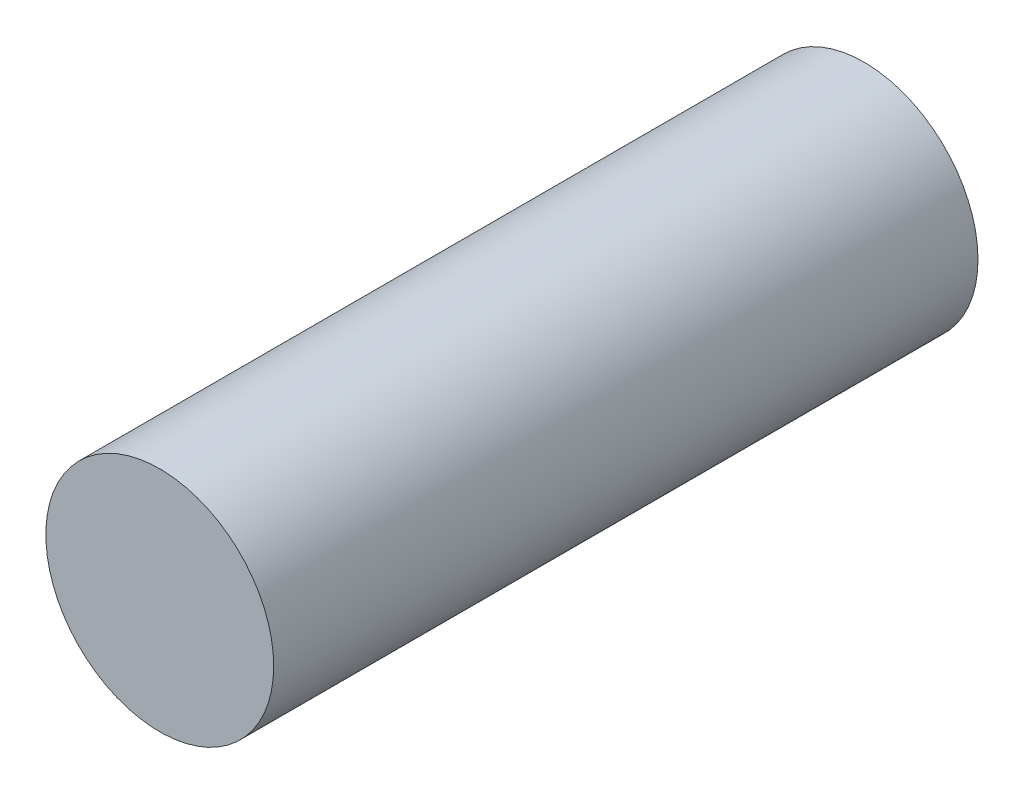
ISO-10303-21;
HEADER;
FILE_DESCRIPTION(('STEP AP214'),'2;1');
FILE_NAME('part.step','',(''),(''),'','','');
FILE_SCHEMA(('AUTOMOTIVE_DESIGN { 1 0 10303 214 1 1 1 1 }'));
ENDSEC;
DATA;
#1=APPLICATION_CONTEXT('core data for automotive mechanical design processes');
#2=APPLICATION_PROTOCOL_DEFINITION('international standard','automotive_design',2000,#1);
#3=PRODUCT_CONTEXT('',#1,'mechanical');
#4=PRODUCT('Part','Part','',(#3));
#5=PRODUCT_RELATED_PRODUCT_CATEGORY('part','',(#4));
#6=PRODUCT_DEFINITION_FORMATION('','',#4);
#7=PRODUCT_DEFINITION_CONTEXT('part definition',#1,'design');
#8=PRODUCT_DEFINITION('design','',#6,#7);
#9=PRODUCT_DEFINITION_SHAPE('','',#8);
#10=(LENGTH_UNIT() NAMED_UNIT(*) SI_UNIT(.MILLI.,.METRE.));
#11=(NAMED_UNIT(*) PLANE_ANGLE_UNIT() SI_UNIT($,.RADIAN.));
#12=(NAMED_UNIT(*) SI_UNIT($,.STERADIAN.) SOLID_ANGLE_UNIT());
#13=UNCERTAINTY_MEASURE_WITH_UNIT(LENGTH_MEASURE(1.E-05),#10,'distance_accuracy_value','');
#14=(GEOMETRIC_REPRESENTATION_CONTEXT(3) GLOBAL_UNCERTAINTY_ASSIGNED_CONTEXT((#13)) GLOBAL_UNIT_ASSIGNED_CONTEXT((#10,
#11,#12)) REPRESENTATION_CONTEXT('',''));
#15=CARTESIAN_POINT('',(0.,0.,0.));
#16=DIRECTION('',(0.,0.,1.));
#17=DIRECTION('',(1.,0.,0.));
#18=AXIS2_PLACEMENT_3D('',#15,#16,#17);
#19=CARTESIAN_POINT('',(0.,0.,68.));
#20=DIRECTION('',(0.,0.,-1.));
#21=DIRECTION('',(-1.,0.,0.));
#22=AXIS2_PLACEMENT_3D('',#19,#20,#21);
#23=CYLINDRICAL_SURFACE('',#22,11.);
#24=CARTESIAN_POINT('',(0.,0.,68.));
#25=DIRECTION('',(0.,0.,1.));
#26=DIRECTION('',(1.,0.,0.));
#27=AXIS2_PLACEMENT_3D('',#24,#25,#26);
#28=CIRCLE('',#27,11.);
#29=CARTESIAN_POINT('',(11.,0.,68.));
#30=VERTEX_POINT('',#29);
#31=EDGE_CURVE('E10',#30,#30,#28,.T.);
#32=ORIENTED_EDGE('',*,*,#31,.F.);
#33=EDGE_LOOP('',(#32));
#34=FACE_BOUND('',#33,.T.);
#35=CARTESIAN_POINT('',(0.,0.,0.));
#36=DIRECTION('',(0.,0.,1.));
#37=DIRECTION('',(1.,0.,0.));
#38=AXIS2_PLACEMENT_3D('',#35,#36,#37);
#39=CIRCLE('',#38,11.);
#40=CARTESIAN_POINT('',(11.,0.,0.));
#41=VERTEX_POINT('',#40);
#42=EDGE_CURVE('E40',#41,#41,#39,.T.);
#43=ORIENTED_EDGE('',*,*,#42,.T.);
#44=EDGE_LOOP('',(#43));
#45=FACE_BOUND('',#44,.T.);
#46=ADVANCED_FACE('F37',(#34,#45),#23,.T.);
#47=CARTESIAN_POINT('',(0.,0.,68.));
#48=DIRECTION('',(0.,0.,1.));
#49=DIRECTION('',(1.,0.,0.));
#50=AXIS2_PLACEMENT_3D('',#47,#48,#49);
#51=PLANE('',#50);
#52=ORIENTED_EDGE('',*,*,#31,.T.);
#53=EDGE_LOOP('',(#52));
#54=FACE_BOUND('',#53,.T.);
#55=ADVANCED_FACE('F54',(#54),#51,.T.);
#56=CARTESIAN_POINT('',(0.,0.,0.));
#57=DIRECTION('',(0.,0.,1.));
#58=DIRECTION('',(1.,0.,0.));
#59=AXIS2_PLACEMENT_3D('',#56,#57,#58);
#60=PLANE('',#59);
#61=ORIENTED_EDGE('',*,*,#42,.F.);
#62=EDGE_LOOP('',(#61));
#63=FACE_BOUND('',#62,.T.);
#64=ADVANCED_FACE('F52',(#63),#60,.F.);
#65=CLOSED_SHELL('',(#46,#55,#64));
#66=MANIFOLD_SOLID_BREP('B2',#65);
#67=ADVANCED_BREP_SHAPE_REPRESENTATION('',(#18,#66),#14);
#68=SHAPE_DEFINITION_REPRESENTATION(#9,#67);
ENDSEC;
END-ISO-10303-21;
